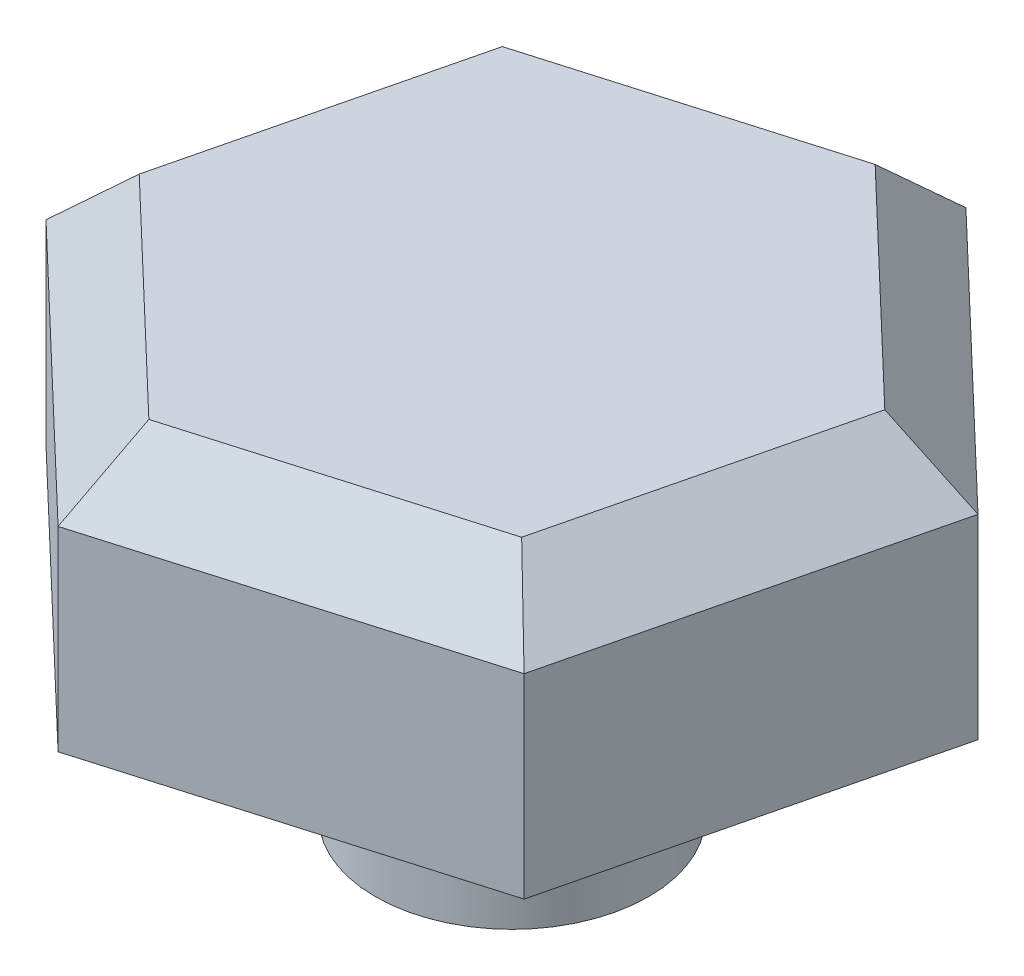
ISO-10303-21;
HEADER;
FILE_DESCRIPTION(('STEP AP214'),'2;1');
FILE_NAME('part.step','',(''),(''),'','','');
FILE_SCHEMA(('AUTOMOTIVE_DESIGN { 1 0 10303 214 1 1 1 1 }'));
ENDSEC;
DATA;
#1=APPLICATION_CONTEXT('core data for automotive mechanical design processes');
#2=APPLICATION_PROTOCOL_DEFINITION('international standard','automotive_design',2000,#1);
#3=PRODUCT_CONTEXT('',#1,'mechanical');
#4=PRODUCT('Part','Part','',(#3));
#5=PRODUCT_RELATED_PRODUCT_CATEGORY('part','',(#4));
#6=PRODUCT_DEFINITION_FORMATION('','',#4);
#7=PRODUCT_DEFINITION_CONTEXT('part definition',#1,'design');
#8=PRODUCT_DEFINITION('design','',#6,#7);
#9=PRODUCT_DEFINITION_SHAPE('','',#8);
#10=(LENGTH_UNIT() NAMED_UNIT(*) SI_UNIT(.MILLI.,.METRE.));
#11=(NAMED_UNIT(*) PLANE_ANGLE_UNIT() SI_UNIT($,.RADIAN.));
#12=(NAMED_UNIT(*) SI_UNIT($,.STERADIAN.) SOLID_ANGLE_UNIT());
#13=UNCERTAINTY_MEASURE_WITH_UNIT(LENGTH_MEASURE(1.E-05),#10,'distance_accuracy_value','');
#14=(GEOMETRIC_REPRESENTATION_CONTEXT(3) GLOBAL_UNCERTAINTY_ASSIGNED_CONTEXT((#13)) GLOBAL_UNIT_ASSIGNED_CONTEXT((#10,
#11,#12)) REPRESENTATION_CONTEXT('',''));
#15=CARTESIAN_POINT('',(0.,0.,0.));
#16=DIRECTION('',(0.,0.,1.));
#17=DIRECTION('',(1.,0.,0.));
#18=AXIS2_PLACEMENT_3D('',#15,#16,#17);
#19=CARTESIAN_POINT('',(4.17418870158849,0.,3.98866920374006));
#20=DIRECTION('',(0.,1.,0.));
#21=DIRECTION('',(0.,0.,1.));
#22=AXIS2_PLACEMENT_3D('',#19,#20,#21);
#23=PLANE('',#22);
#24=DIRECTION('',(0.95979572613757,0.,-0.28069941946512));
#25=VECTOR('',#24,1.);
#26=CARTESIAN_POINT('',(-1.36719450693728,0.,5.60928805763565));
#27=LINE('',#26,#25);
#28=CARTESIAN_POINT('',(-1.36719450693728,0.,5.60928805763565));
#29=VERTEX_POINT('',#28);
#30=CARTESIAN_POINT('',(4.17418870158849,0.,3.98866920374006));
#31=VERTEX_POINT('',#30);
#32=EDGE_CURVE('E117',#29,#31,#27,.T.);
#33=ORIENTED_EDGE('',*,*,#32,.F.);
#34=DIRECTION('',(0.722990691153123,0.,0.690857771546307));
#35=VECTOR('',#34,1.);
#36=CARTESIAN_POINT('',(-5.54138320852578,0.,1.62061885389559));
#37=LINE('',#36,#35);
#38=CARTESIAN_POINT('',(-5.54138320852578,0.,1.62061885389559));
#39=VERTEX_POINT('',#38);
#40=EDGE_CURVE('E140',#39,#29,#37,.T.);
#41=ORIENTED_EDGE('',*,*,#40,.F.);
#42=DIRECTION('',(-0.236805034984447,0.,0.971557191011427));
#43=VECTOR('',#42,1.);
#44=CARTESIAN_POINT('',(-4.17418870158849,0.,-3.98866920374005));
#45=LINE('',#44,#43);
#46=CARTESIAN_POINT('',(-4.17418870158849,0.,-3.98866920374005));
#47=VERTEX_POINT('',#46);
#48=EDGE_CURVE('E137',#47,#39,#45,.T.);
#49=ORIENTED_EDGE('',*,*,#48,.F.);
#50=DIRECTION('',(-0.95979572613757,0.,0.28069941946512));
#51=VECTOR('',#50,1.);
#52=CARTESIAN_POINT('',(1.36719450693729,0.,-5.60928805763564));
#53=LINE('',#52,#51);
#54=CARTESIAN_POINT('',(1.36719450693729,0.,-5.60928805763564));
#55=VERTEX_POINT('',#54);
#56=EDGE_CURVE('E134',#55,#47,#53,.T.);
#57=ORIENTED_EDGE('',*,*,#56,.F.);
#58=DIRECTION('',(-0.722990691153123,0.,-0.690857771546307));
#59=VECTOR('',#58,1.);
#60=CARTESIAN_POINT('',(5.54138320852578,0.,-1.62061885389559));
#61=LINE('',#60,#59);
#62=CARTESIAN_POINT('',(5.54138320852578,0.,-1.62061885389559));
#63=VERTEX_POINT('',#62);
#64=EDGE_CURVE('E120',#63,#55,#61,.T.);
#65=ORIENTED_EDGE('',*,*,#64,.F.);
#66=DIRECTION('',(0.236805034984446,0.,-0.971557191011427));
#67=VECTOR('',#66,1.);
#68=CARTESIAN_POINT('',(4.17418870158849,0.,3.98866920374006));
#69=LINE('',#68,#67);
#70=EDGE_CURVE('E105',#31,#63,#69,.T.);
#71=ORIENTED_EDGE('',*,*,#70,.F.);
#72=EDGE_LOOP('',(#33,#41,#49,#57,#65,#71));
#73=FACE_BOUND('',#72,.T.);
#74=CARTESIAN_POINT('',(0.,0.,0.));
#75=DIRECTION('',(0.,1.,0.));
#76=DIRECTION('',(0.,0.,1.));
#77=AXIS2_PLACEMENT_3D('',#74,#75,#76);
#78=CIRCLE('',#77,2.1);
#79=CARTESIAN_POINT('',(0.,0.,2.1));
#80=VERTEX_POINT('',#79);
#81=EDGE_CURVE('E11',#80,#80,#78,.F.);
#82=ORIENTED_EDGE('',*,*,#81,.F.);
#83=EDGE_LOOP('',(#82));
#84=FACE_BOUND('',#83,.T.);
#85=ADVANCED_FACE('F32',(#73,#84),#23,.F.);
#86=CARTESIAN_POINT('',(-1.36719450693728,4.,5.60928805763565));
#87=DIRECTION('',(-0.28069941946512,0.,-0.95979572613757));
#88=DIRECTION('',(-0.95979572613757,0.,0.28069941946512));
#89=AXIS2_PLACEMENT_3D('',#86,#87,#88);
#90=PLANE('',#89);
#91=DIRECTION('',(0.,-1.,0.));
#92=VECTOR('',#91,1.);
#93=CARTESIAN_POINT('',(4.17418870158849,4.,3.98866920374006));
#94=LINE('',#93,#92);
#95=CARTESIAN_POINT('',(4.17418870158849,3.,3.98866920374006));
#96=VERTEX_POINT('',#95);
#97=EDGE_CURVE('E102',#96,#31,#94,.T.);
#98=ORIENTED_EDGE('',*,*,#97,.F.);
#99=DIRECTION('',(-0.95979572613757,0.,0.28069941946512));
#100=VECTOR('',#99,1.);
#101=CARTESIAN_POINT('',(-1.36719450693728,3.,5.60928805763565));
#102=LINE('',#101,#100);
#103=CARTESIAN_POINT('',(-1.36719450693728,3.,5.60928805763565));
#104=VERTEX_POINT('',#103);
#105=EDGE_CURVE('E40',#96,#104,#102,.T.);
#106=ORIENTED_EDGE('',*,*,#105,.T.);
#107=DIRECTION('',(0.,-1.,0.));
#108=VECTOR('',#107,1.);
#109=CARTESIAN_POINT('',(-1.36719450693728,4.,5.60928805763565));
#110=LINE('',#109,#108);
#111=EDGE_CURVE('E124',#104,#29,#110,.T.);
#112=ORIENTED_EDGE('',*,*,#111,.T.);
#113=ORIENTED_EDGE('',*,*,#32,.T.);
#114=EDGE_LOOP('',(#98,#106,#112,#113));
#115=FACE_BOUND('',#114,.T.);
#116=ADVANCED_FACE('F122',(#115),#90,.F.);
#117=CARTESIAN_POINT('',(4.17418870158849,4.,3.98866920374006));
#118=DIRECTION('',(-0.971557191011427,0.,-0.236805034984446));
#119=DIRECTION('',(-0.236805034984446,0.,0.971557191011427));
#120=AXIS2_PLACEMENT_3D('',#117,#118,#119);
#121=PLANE('',#120);
#122=DIRECTION('',(0.,-1.,0.));
#123=VECTOR('',#122,1.);
#124=CARTESIAN_POINT('',(5.54138320852578,4.,-1.62061885389559));
#125=LINE('',#124,#123);
#126=CARTESIAN_POINT('',(5.54138320852578,3.,-1.62061885389559));
#127=VERTEX_POINT('',#126);
#128=EDGE_CURVE('E111',#127,#63,#125,.T.);
#129=ORIENTED_EDGE('',*,*,#128,.F.);
#130=DIRECTION('',(-0.236805034984446,0.,0.971557191011427));
#131=VECTOR('',#130,1.);
#132=CARTESIAN_POINT('',(4.17418870158849,3.,3.98866920374006));
#133=LINE('',#132,#131);
#134=EDGE_CURVE('E47',#127,#96,#133,.T.);
#135=ORIENTED_EDGE('',*,*,#134,.T.);
#136=ORIENTED_EDGE('',*,*,#97,.T.);
#137=ORIENTED_EDGE('',*,*,#70,.T.);
#138=EDGE_LOOP('',(#129,#135,#136,#137));
#139=FACE_BOUND('',#138,.T.);
#140=ADVANCED_FACE('F104',(#139),#121,.F.);
#141=CARTESIAN_POINT('',(5.54138320852578,4.,-1.62061885389559));
#142=DIRECTION('',(-0.690857771546307,0.,0.722990691153123));
#143=DIRECTION('',(0.722990691153123,0.,0.690857771546307));
#144=AXIS2_PLACEMENT_3D('',#141,#142,#143);
#145=PLANE('',#144);
#146=DIRECTION('',(0.,-1.,0.));
#147=VECTOR('',#146,1.);
#148=CARTESIAN_POINT('',(1.36719450693729,4.,-5.60928805763564));
#149=LINE('',#148,#147);
#150=CARTESIAN_POINT('',(1.36719450693729,3.,-5.60928805763564));
#151=VERTEX_POINT('',#150);
#152=EDGE_CURVE('E147',#151,#55,#149,.T.);
#153=ORIENTED_EDGE('',*,*,#152,.F.);
#154=DIRECTION('',(0.722990691153123,0.,0.690857771546307));
#155=VECTOR('',#154,1.);
#156=CARTESIAN_POINT('',(5.54138320852578,3.,-1.62061885389559));
#157=LINE('',#156,#155);
#158=EDGE_CURVE('E55',#151,#127,#157,.T.);
#159=ORIENTED_EDGE('',*,*,#158,.T.);
#160=ORIENTED_EDGE('',*,*,#128,.T.);
#161=ORIENTED_EDGE('',*,*,#64,.T.);
#162=EDGE_LOOP('',(#153,#159,#160,#161));
#163=FACE_BOUND('',#162,.T.);
#164=ADVANCED_FACE('F241',(#163),#145,.F.);
#165=CARTESIAN_POINT('',(1.36719450693729,4.,-5.60928805763564));
#166=DIRECTION('',(0.28069941946512,0.,0.95979572613757));
#167=DIRECTION('',(0.95979572613757,0.,-0.28069941946512));
#168=AXIS2_PLACEMENT_3D('',#165,#166,#167);
#169=PLANE('',#168);
#170=DIRECTION('',(0.,-1.,0.));
#171=VECTOR('',#170,1.);
#172=CARTESIAN_POINT('',(-4.17418870158849,4.,-3.98866920374005));
#173=LINE('',#172,#171);
#174=CARTESIAN_POINT('',(-4.17418870158849,3.,-3.98866920374005));
#175=VERTEX_POINT('',#174);
#176=EDGE_CURVE('E145',#175,#47,#173,.T.);
#177=ORIENTED_EDGE('',*,*,#176,.F.);
#178=DIRECTION('',(0.95979572613757,0.,-0.28069941946512));
#179=VECTOR('',#178,1.);
#180=CARTESIAN_POINT('',(1.36719450693729,3.,-5.60928805763564));
#181=LINE('',#180,#179);
#182=EDGE_CURVE('E167',#175,#151,#181,.T.);
#183=ORIENTED_EDGE('',*,*,#182,.T.);
#184=ORIENTED_EDGE('',*,*,#152,.T.);
#185=ORIENTED_EDGE('',*,*,#56,.T.);
#186=EDGE_LOOP('',(#177,#183,#184,#185));
#187=FACE_BOUND('',#186,.T.);
#188=ADVANCED_FACE('F216',(#187),#169,.F.);
#189=CARTESIAN_POINT('',(-4.17418870158849,4.,-3.98866920374005));
#190=DIRECTION('',(0.971557191011427,0.,0.236805034984447));
#191=DIRECTION('',(0.236805034984447,0.,-0.971557191011427));
#192=AXIS2_PLACEMENT_3D('',#189,#190,#191);
#193=PLANE('',#192);
#194=DIRECTION('',(0.,-1.,0.));
#195=VECTOR('',#194,1.);
#196=CARTESIAN_POINT('',(-5.54138320852578,4.,1.62061885389559));
#197=LINE('',#196,#195);
#198=CARTESIAN_POINT('',(-5.54138320852578,3.,1.62061885389559));
#199=VERTEX_POINT('',#198);
#200=EDGE_CURVE('E143',#199,#39,#197,.T.);
#201=ORIENTED_EDGE('',*,*,#200,.F.);
#202=DIRECTION('',(0.236805034984447,0.,-0.971557191011427));
#203=VECTOR('',#202,1.);
#204=CARTESIAN_POINT('',(-4.17418870158849,3.,-3.98866920374005));
#205=LINE('',#204,#203);
#206=EDGE_CURVE('E165',#199,#175,#205,.T.);
#207=ORIENTED_EDGE('',*,*,#206,.T.);
#208=ORIENTED_EDGE('',*,*,#176,.T.);
#209=ORIENTED_EDGE('',*,*,#48,.T.);
#210=EDGE_LOOP('',(#201,#207,#208,#209));
#211=FACE_BOUND('',#210,.T.);
#212=ADVANCED_FACE('F213',(#211),#193,.F.);
#213=CARTESIAN_POINT('',(-5.54138320852578,4.,1.62061885389559));
#214=DIRECTION('',(0.690857771546307,0.,-0.722990691153123));
#215=DIRECTION('',(-0.722990691153123,0.,-0.690857771546307));
#216=AXIS2_PLACEMENT_3D('',#213,#214,#215);
#217=PLANE('',#216);
#218=ORIENTED_EDGE('',*,*,#111,.F.);
#219=DIRECTION('',(-0.722990691153123,0.,-0.690857771546307));
#220=VECTOR('',#219,1.);
#221=CARTESIAN_POINT('',(-5.54138320852578,3.,1.62061885389559));
#222=LINE('',#221,#220);
#223=EDGE_CURVE('E162',#104,#199,#222,.T.);
#224=ORIENTED_EDGE('',*,*,#223,.T.);
#225=ORIENTED_EDGE('',*,*,#200,.T.);
#226=ORIENTED_EDGE('',*,*,#40,.T.);
#227=EDGE_LOOP('',(#218,#224,#225,#226));
#228=FACE_BOUND('',#227,.T.);
#229=ADVANCED_FACE('F202',(#228),#217,.F.);
#230=CARTESIAN_POINT('',(4.17418870158849,4.,3.98866920374006));
#231=DIRECTION('',(0.,1.,0.));
#232=DIRECTION('',(0.,0.,1.));
#233=AXIS2_PLACEMENT_3D('',#230,#231,#232);
#234=PLANE('',#233);
#235=DIRECTION('',(-0.236805034984447,0.,0.971557191011427));
#236=VECTOR('',#235,1.);
#237=CARTESIAN_POINT('',(-4.56982601751436,4.,1.85742388888003));
#238=LINE('',#237,#236);
#239=CARTESIAN_POINT('',(-3.3393509612708,4.,-3.19093536299204));
#240=VERTEX_POINT('',#239);
#241=CARTESIAN_POINT('',(-4.43310656682063,4.,1.29649508311647));
#242=VERTEX_POINT('',#241);
#243=EDGE_CURVE('E157',#240,#242,#238,.T.);
#244=ORIENTED_EDGE('',*,*,#243,.T.);
#245=DIRECTION('',(0.722990691153123,0.,0.690857771546307));
#246=VECTOR('',#245,1.);
#247=CARTESIAN_POINT('',(-0.676336735390978,4.,4.88629736648252));
#248=LINE('',#247,#246);
#249=CARTESIAN_POINT('',(-1.09375560554983,4.,4.48743044610852));
#250=VERTEX_POINT('',#249);
#251=EDGE_CURVE('E159',#242,#250,#248,.T.);
#252=ORIENTED_EDGE('',*,*,#251,.T.);
#253=DIRECTION('',(0.95979572613757,0.,-0.28069941946512));
#254=VECTOR('',#253,1.);
#255=CARTESIAN_POINT('',(3.89348928212337,4.,3.02887347760249));
#256=LINE('',#255,#254);
#257=CARTESIAN_POINT('',(3.33935096127079,4.,3.19093536299205));
#258=VERTEX_POINT('',#257);
#259=EDGE_CURVE('E110',#250,#258,#256,.T.);
#260=ORIENTED_EDGE('',*,*,#259,.T.);
#261=DIRECTION('',(0.236805034984446,0.,-0.971557191011427));
#262=VECTOR('',#261,1.);
#263=CARTESIAN_POINT('',(4.56982601751436,4.,-1.85742388888003));
#264=LINE('',#263,#262);
#265=CARTESIAN_POINT('',(4.43310656682063,4.,-1.29649508311647));
#266=VERTEX_POINT('',#265);
#267=EDGE_CURVE('E151',#258,#266,#264,.T.);
#268=ORIENTED_EDGE('',*,*,#267,.T.);
#269=DIRECTION('',(-0.722990691153123,0.,-0.690857771546307));
#270=VECTOR('',#269,1.);
#271=CARTESIAN_POINT('',(0.676336735390984,4.,-4.88629736648252));
#272=LINE('',#271,#270);
#273=CARTESIAN_POINT('',(1.09375560554983,4.,-4.48743044610851));
#274=VERTEX_POINT('',#273);
#275=EDGE_CURVE('E153',#266,#274,#272,.T.);
#276=ORIENTED_EDGE('',*,*,#275,.T.);
#277=DIRECTION('',(-0.95979572613757,0.,0.28069941946512));
#278=VECTOR('',#277,1.);
#279=CARTESIAN_POINT('',(-3.89348928212337,4.,-3.02887347760249));
#280=LINE('',#279,#278);
#281=EDGE_CURVE('E155',#274,#240,#280,.T.);
#282=ORIENTED_EDGE('',*,*,#281,.T.);
#283=EDGE_LOOP('',(#244,#252,#260,#268,#276,#282));
#284=FACE_BOUND('',#283,.T.);
#285=ADVANCED_FACE('F192',(#284),#234,.T.);
#286=CARTESIAN_POINT('',(6.93761978777372,4.,1.09670643912756));
#287=DIRECTION('',(0.488510215095822,0.707106781186545,-0.511231620449124));
#288=DIRECTION('',(0.,0.58589975403934,0.810383537725589));
#289=AXIS2_PLACEMENT_3D('',#286,#287,#288);
#290=PLANE('',#289);
#291=DIRECTION('',(-0.725537371652188,0.654653670707979,0.21218881630426));
#292=VECTOR('',#291,1.);
#293=CARTESIAN_POINT('',(3.00817945605686,5.28571428571429,-0.879764520686178));
#294=LINE('',#293,#292);
#295=EDGE_CURVE('E129',#127,#266,#294,.T.);
#296=ORIENTED_EDGE('',*,*,#295,.F.);
#297=ORIENTED_EDGE('',*,*,#158,.F.);
#298=DIRECTION('',(-0.179007780507656,0.65465367070798,0.734428203397916));
#299=VECTOR('',#298,1.);
#300=CARTESIAN_POINT('',(0.546877802774921,6.,-2.24371522305427));
#301=LINE('',#300,#299);
#302=EDGE_CURVE('E126',#274,#151,#301,.F.);
#303=ORIENTED_EDGE('',*,*,#302,.F.);
#304=ORIENTED_EDGE('',*,*,#275,.F.);
#305=EDGE_LOOP('',(#296,#297,#303,#304));
#306=FACE_BOUND('',#305,.T.);
#307=ADVANCED_FACE('F34',(#306),#290,.T.);
#308=CARTESIAN_POINT('',(1.64789392640241,4.,-4.64949233149807));
#309=DIRECTION('',(-0.198484462978914,0.707106781186545,-0.678678066505744));
#310=DIRECTION('',(0.,0.692455130055739,0.721460943405455));
#311=AXIS2_PLACEMENT_3D('',#308,#309,#310);
#312=PLANE('',#311);
#313=ORIENTED_EDGE('',*,*,#302,.T.);
#314=ORIENTED_EDGE('',*,*,#182,.F.);
#315=DIRECTION('',(0.546529591144532,0.65465367070798,0.522239387093657));
#316=VECTOR('',#315,1.);
#317=CARTESIAN_POINT('',(-2.2659881522909,5.28571428571429,-2.16527756774461));
#318=LINE('',#317,#316);
#319=EDGE_CURVE('E179',#240,#175,#318,.F.);
#320=ORIENTED_EDGE('',*,*,#319,.F.);
#321=ORIENTED_EDGE('',*,*,#281,.F.);
#322=EDGE_LOOP('',(#313,#314,#320,#321));
#323=FACE_BOUND('',#322,.T.);
#324=ADVANCED_FACE('F219',(#323),#312,.T.);
#325=CARTESIAN_POINT('',(3.20263151057706,4.,3.75186416875561));
#326=DIRECTION('',(0.686994678074736,0.707106781186545,0.16744644605662));
#327=DIRECTION('',(-0.717233273538908,0.696833144539396,0.));
#328=AXIS2_PLACEMENT_3D('',#325,#326,#327);
#329=PLANE('',#328);
#330=ORIENTED_EDGE('',*,*,#295,.T.);
#331=ORIENTED_EDGE('',*,*,#267,.F.);
#332=DIRECTION('',(-0.546529591144533,0.654653670707979,-0.522239387093657));
#333=VECTOR('',#332,1.);
#334=CARTESIAN_POINT('',(3.45861349560189,3.85714285714286,3.30489734024177));
#335=LINE('',#334,#333);
#336=EDGE_CURVE('E176',#96,#258,#335,.T.);
#337=ORIENTED_EDGE('',*,*,#336,.F.);
#338=ORIENTED_EDGE('',*,*,#134,.F.);
#339=EDGE_LOOP('',(#330,#331,#337,#338));
#340=FACE_BOUND('',#339,.T.);
#341=ADVANCED_FACE('F186',(#340),#329,.T.);
#342=CARTESIAN_POINT('',(-4.56982601751436,4.,1.85742388888004));
#343=DIRECTION('',(-0.686994678074736,0.707106781186545,-0.16744644605662));
#344=DIRECTION('',(-0.717233273538907,-0.696833144539396,0.));
#345=AXIS2_PLACEMENT_3D('',#342,#343,#344);
#346=PLANE('',#345);
#347=ORIENTED_EDGE('',*,*,#319,.T.);
#348=ORIENTED_EDGE('',*,*,#206,.F.);
#349=DIRECTION('',(0.725537371652188,0.65465367070798,-0.21218881630426));
#350=VECTOR('',#349,1.);
#351=CARTESIAN_POINT('',(-4.59143180134994,3.85714285714286,1.34279847894206));
#352=LINE('',#351,#350);
#353=EDGE_CURVE('E174',#242,#199,#352,.F.);
#354=ORIENTED_EDGE('',*,*,#353,.F.);
#355=ORIENTED_EDGE('',*,*,#243,.F.);
#356=EDGE_LOOP('',(#347,#348,#354,#355));
#357=FACE_BOUND('',#356,.T.);
#358=ADVANCED_FACE('F210',(#357),#346,.T.);
#359=CARTESIAN_POINT('',(3.89348928212337,4.,3.02887347760249));
#360=DIRECTION('',(0.198484462978914,0.707106781186545,0.678678066505744));
#361=DIRECTION('',(0.,-0.692455130055739,0.721460943405455));
#362=AXIS2_PLACEMENT_3D('',#359,#360,#361);
#363=PLANE('',#362);
#364=ORIENTED_EDGE('',*,*,#336,.T.);
#365=ORIENTED_EDGE('',*,*,#259,.F.);
#366=DIRECTION('',(-0.179007780507655,-0.654653670707979,0.734428203397916));
#367=VECTOR('',#366,1.);
#368=CARTESIAN_POINT('',(-0.742191303765954,5.28571428571428,3.04504208843079));
#369=LINE('',#368,#367);
#370=EDGE_CURVE('E172',#104,#250,#369,.F.);
#371=ORIENTED_EDGE('',*,*,#370,.F.);
#372=ORIENTED_EDGE('',*,*,#105,.F.);
#373=EDGE_LOOP('',(#364,#365,#371,#372));
#374=FACE_BOUND('',#373,.T.);
#375=ADVANCED_FACE('F198',(#374),#363,.T.);
#376=CARTESIAN_POINT('',(1.41075761540327,4.,6.88063196835255));
#377=DIRECTION('',(-0.488510215095822,0.707106781186545,0.511231620449124));
#378=DIRECTION('',(0.,-0.58589975403934,0.810383537725589));
#379=AXIS2_PLACEMENT_3D('',#376,#377,#378);
#380=PLANE('',#379);
#381=ORIENTED_EDGE('',*,*,#353,.T.);
#382=ORIENTED_EDGE('',*,*,#223,.F.);
#383=ORIENTED_EDGE('',*,*,#370,.T.);
#384=ORIENTED_EDGE('',*,*,#251,.F.);
#385=EDGE_LOOP('',(#381,#382,#383,#384));
#386=FACE_BOUND('',#385,.T.);
#387=ADVANCED_FACE('F205',(#386),#380,.T.);
#388=CARTESIAN_POINT('',(0.,-3.,0.));
#389=DIRECTION('',(0.,1.,0.));
#390=DIRECTION('',(0.,0.,1.));
#391=AXIS2_PLACEMENT_3D('',#388,#389,#390);
#392=CYLINDRICAL_SURFACE('',#391,2.1);
#393=CARTESIAN_POINT('',(0.,-3.,0.));
#394=DIRECTION('',(0.,-1.,0.));
#395=DIRECTION('',(0.,0.,-1.));
#396=AXIS2_PLACEMENT_3D('',#393,#394,#395);
#397=CIRCLE('',#396,2.1);
#398=CARTESIAN_POINT('',(0.,-3.,-2.1));
#399=VERTEX_POINT('',#398);
#400=EDGE_CURVE('E131',#399,#399,#397,.T.);
#401=ORIENTED_EDGE('',*,*,#400,.F.);
#402=EDGE_LOOP('',(#401));
#403=FACE_BOUND('',#402,.T.);
#404=ORIENTED_EDGE('',*,*,#81,.T.);
#405=EDGE_LOOP('',(#404));
#406=FACE_BOUND('',#405,.T.);
#407=ADVANCED_FACE('F248',(#403,#406),#392,.T.);
#408=CARTESIAN_POINT('',(0.,-3.,0.));
#409=DIRECTION('',(0.,-1.,0.));
#410=DIRECTION('',(0.,0.,-1.));
#411=AXIS2_PLACEMENT_3D('',#408,#409,#410);
#412=PLANE('',#411);
#413=ORIENTED_EDGE('',*,*,#400,.T.);
#414=EDGE_LOOP('',(#413));
#415=FACE_BOUND('',#414,.T.);
#416=ADVANCED_FACE('F270',(#415),#412,.T.);
#417=CLOSED_SHELL('',(#85,#116,#140,#164,#188,#212,#229,#285,#307,#324,#341,#358,#375,#387,#407,#416));
#418=MANIFOLD_SOLID_BREP('B2',#417);
#419=ADVANCED_BREP_SHAPE_REPRESENTATION('',(#18,#418),#14);
#420=SHAPE_DEFINITION_REPRESENTATION(#9,#419);
ENDSEC;
END-ISO-10303-21;
